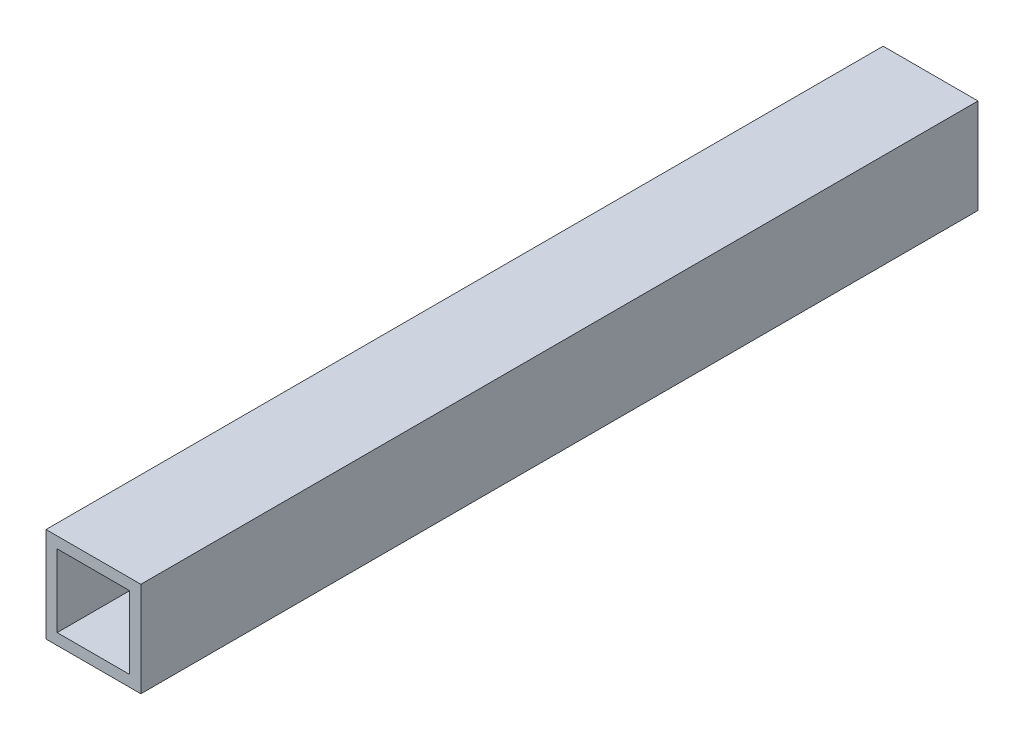
ISO-10303-21;
HEADER;
FILE_DESCRIPTION(('STEP AP214'),'2;1');
FILE_NAME('part.step','',(''),(''),'','','');
FILE_SCHEMA(('AUTOMOTIVE_DESIGN { 1 0 10303 214 1 1 1 1 }'));
ENDSEC;
DATA;
#1=APPLICATION_CONTEXT('core data for automotive mechanical design processes');
#2=APPLICATION_PROTOCOL_DEFINITION('international standard','automotive_design',2000,#1);
#3=PRODUCT_CONTEXT('',#1,'mechanical');
#4=PRODUCT('Part','Part','',(#3));
#5=PRODUCT_RELATED_PRODUCT_CATEGORY('part','',(#4));
#6=PRODUCT_DEFINITION_FORMATION('','',#4);
#7=PRODUCT_DEFINITION_CONTEXT('part definition',#1,'design');
#8=PRODUCT_DEFINITION('design','',#6,#7);
#9=PRODUCT_DEFINITION_SHAPE('','',#8);
#10=(LENGTH_UNIT() NAMED_UNIT(*) SI_UNIT(.MILLI.,.METRE.));
#11=(NAMED_UNIT(*) PLANE_ANGLE_UNIT() SI_UNIT($,.RADIAN.));
#12=(NAMED_UNIT(*) SI_UNIT($,.STERADIAN.) SOLID_ANGLE_UNIT());
#13=UNCERTAINTY_MEASURE_WITH_UNIT(LENGTH_MEASURE(1.E-05),#10,'distance_accuracy_value','');
#14=(GEOMETRIC_REPRESENTATION_CONTEXT(3) GLOBAL_UNCERTAINTY_ASSIGNED_CONTEXT((#13)) GLOBAL_UNIT_ASSIGNED_CONTEXT((#10,
#11,#12)) REPRESENTATION_CONTEXT('',''));
#15=CARTESIAN_POINT('',(0.,0.,0.));
#16=DIRECTION('',(0.,0.,1.));
#17=DIRECTION('',(1.,0.,0.));
#18=AXIS2_PLACEMENT_3D('',#15,#16,#17);
#19=CARTESIAN_POINT('',(0.,0.,150.));
#20=DIRECTION('',(0.,0.,-1.));
#21=DIRECTION('',(-1.,0.,0.));
#22=AXIS2_PLACEMENT_3D('',#19,#20,#21);
#23=PLANE('',#22);
#24=DIRECTION('',(0.,1.,0.));
#25=VECTOR('',#24,1.);
#26=CARTESIAN_POINT('',(8.5,-8.5,150.));
#27=LINE('',#26,#25);
#28=CARTESIAN_POINT('',(8.5,-8.5,150.));
#29=VERTEX_POINT('',#28);
#30=CARTESIAN_POINT('',(8.5,8.5,150.));
#31=VERTEX_POINT('',#30);
#32=EDGE_CURVE('E153',#29,#31,#27,.T.);
#33=ORIENTED_EDGE('',*,*,#32,.T.);
#34=DIRECTION('',(-1.,0.,0.));
#35=VECTOR('',#34,1.);
#36=CARTESIAN_POINT('',(-8.5,8.5,150.));
#37=LINE('',#36,#35);
#38=CARTESIAN_POINT('',(-8.5,8.5,150.));
#39=VERTEX_POINT('',#38);
#40=EDGE_CURVE('E157',#31,#39,#37,.T.);
#41=ORIENTED_EDGE('',*,*,#40,.T.);
#42=DIRECTION('',(0.,-1.,0.));
#43=VECTOR('',#42,1.);
#44=CARTESIAN_POINT('',(-8.5,-8.5,150.));
#45=LINE('',#44,#43);
#46=CARTESIAN_POINT('',(-8.5,-8.5,150.));
#47=VERTEX_POINT('',#46);
#48=EDGE_CURVE('E161',#39,#47,#45,.T.);
#49=ORIENTED_EDGE('',*,*,#48,.T.);
#50=DIRECTION('',(1.,0.,0.));
#51=VECTOR('',#50,1.);
#52=CARTESIAN_POINT('',(-8.5,-8.5,150.));
#53=LINE('',#52,#51);
#54=EDGE_CURVE('E164',#47,#29,#53,.T.);
#55=ORIENTED_EDGE('',*,*,#54,.T.);
#56=EDGE_LOOP('',(#33,#41,#49,#55));
#57=FACE_BOUND('',#56,.T.);
#58=DIRECTION('',(1.,0.,0.));
#59=VECTOR('',#58,1.);
#60=CARTESIAN_POINT('',(-6.5,-6.5,150.));
#61=LINE('',#60,#59);
#62=CARTESIAN_POINT('',(-6.5,-6.5,150.));
#63=VERTEX_POINT('',#62);
#64=CARTESIAN_POINT('',(6.5,-6.5,150.));
#65=VERTEX_POINT('',#64);
#66=EDGE_CURVE('E105',#63,#65,#61,.T.);
#67=ORIENTED_EDGE('',*,*,#66,.F.);
#68=DIRECTION('',(0.,-1.,0.));
#69=VECTOR('',#68,1.);
#70=CARTESIAN_POINT('',(-6.5,-6.5,150.));
#71=LINE('',#70,#69);
#72=CARTESIAN_POINT('',(-6.5,6.5,150.));
#73=VERTEX_POINT('',#72);
#74=EDGE_CURVE('E131',#73,#63,#71,.T.);
#75=ORIENTED_EDGE('',*,*,#74,.F.);
#76=DIRECTION('',(-1.,0.,0.));
#77=VECTOR('',#76,1.);
#78=CARTESIAN_POINT('',(-6.5,6.5,150.));
#79=LINE('',#78,#77);
#80=CARTESIAN_POINT('',(6.5,6.5,150.));
#81=VERTEX_POINT('',#80);
#82=EDGE_CURVE('E127',#81,#73,#79,.T.);
#83=ORIENTED_EDGE('',*,*,#82,.F.);
#84=DIRECTION('',(0.,1.,0.));
#85=VECTOR('',#84,1.);
#86=CARTESIAN_POINT('',(6.5,-6.5,150.));
#87=LINE('',#86,#85);
#88=EDGE_CURVE('E114',#65,#81,#87,.T.);
#89=ORIENTED_EDGE('',*,*,#88,.F.);
#90=EDGE_LOOP('',(#67,#75,#83,#89));
#91=FACE_BOUND('',#90,.T.);
#92=ADVANCED_FACE('F39',(#57,#91),#23,.F.);
#93=CARTESIAN_POINT('',(0.,0.,0.));
#94=DIRECTION('',(0.,0.,-1.));
#95=DIRECTION('',(-1.,0.,0.));
#96=AXIS2_PLACEMENT_3D('',#93,#94,#95);
#97=PLANE('',#96);
#98=DIRECTION('',(0.,1.,0.));
#99=VECTOR('',#98,1.);
#100=CARTESIAN_POINT('',(8.5,-8.5,0.));
#101=LINE('',#100,#99);
#102=CARTESIAN_POINT('',(8.5,-8.5,0.));
#103=VERTEX_POINT('',#102);
#104=CARTESIAN_POINT('',(8.5,8.5,0.));
#105=VERTEX_POINT('',#104);
#106=EDGE_CURVE('E123',#103,#105,#101,.T.);
#107=ORIENTED_EDGE('',*,*,#106,.F.);
#108=DIRECTION('',(1.,0.,0.));
#109=VECTOR('',#108,1.);
#110=CARTESIAN_POINT('',(-8.5,-8.5,0.));
#111=LINE('',#110,#109);
#112=CARTESIAN_POINT('',(-8.5,-8.5,0.));
#113=VERTEX_POINT('',#112);
#114=EDGE_CURVE('E158',#113,#103,#111,.T.);
#115=ORIENTED_EDGE('',*,*,#114,.F.);
#116=DIRECTION('',(0.,-1.,0.));
#117=VECTOR('',#116,1.);
#118=CARTESIAN_POINT('',(-8.5,-8.5,0.));
#119=LINE('',#118,#117);
#120=CARTESIAN_POINT('',(-8.5,8.5,0.));
#121=VERTEX_POINT('',#120);
#122=EDGE_CURVE('E174',#121,#113,#119,.T.);
#123=ORIENTED_EDGE('',*,*,#122,.F.);
#124=DIRECTION('',(-1.,0.,0.));
#125=VECTOR('',#124,1.);
#126=CARTESIAN_POINT('',(-8.5,8.5,0.));
#127=LINE('',#126,#125);
#128=EDGE_CURVE('E171',#105,#121,#127,.T.);
#129=ORIENTED_EDGE('',*,*,#128,.F.);
#130=EDGE_LOOP('',(#107,#115,#123,#129));
#131=FACE_BOUND('',#130,.T.);
#132=DIRECTION('',(0.,-1.,0.));
#133=VECTOR('',#132,1.);
#134=CARTESIAN_POINT('',(-6.5,-6.5,0.));
#135=LINE('',#134,#133);
#136=CARTESIAN_POINT('',(-6.5,6.5,0.));
#137=VERTEX_POINT('',#136);
#138=CARTESIAN_POINT('',(-6.5,-6.5,0.));
#139=VERTEX_POINT('',#138);
#140=EDGE_CURVE('E115',#137,#139,#135,.T.);
#141=ORIENTED_EDGE('',*,*,#140,.T.);
#142=DIRECTION('',(1.,0.,0.));
#143=VECTOR('',#142,1.);
#144=CARTESIAN_POINT('',(-6.5,-6.5,0.));
#145=LINE('',#144,#143);
#146=CARTESIAN_POINT('',(6.5,-6.5,0.));
#147=VERTEX_POINT('',#146);
#148=EDGE_CURVE('E63',#139,#147,#145,.T.);
#149=ORIENTED_EDGE('',*,*,#148,.T.);
#150=DIRECTION('',(0.,1.,0.));
#151=VECTOR('',#150,1.);
#152=CARTESIAN_POINT('',(6.5,-6.5,0.));
#153=LINE('',#152,#151);
#154=CARTESIAN_POINT('',(6.5,6.5,0.));
#155=VERTEX_POINT('',#154);
#156=EDGE_CURVE('E121',#147,#155,#153,.T.);
#157=ORIENTED_EDGE('',*,*,#156,.T.);
#158=DIRECTION('',(-1.,0.,0.));
#159=VECTOR('',#158,1.);
#160=CARTESIAN_POINT('',(-6.5,6.5,0.));
#161=LINE('',#160,#159);
#162=EDGE_CURVE('E140',#155,#137,#161,.T.);
#163=ORIENTED_EDGE('',*,*,#162,.T.);
#164=EDGE_LOOP('',(#141,#149,#157,#163));
#165=FACE_BOUND('',#164,.T.);
#166=ADVANCED_FACE('F197',(#131,#165),#97,.T.);
#167=CARTESIAN_POINT('',(8.5,-8.5,150.));
#168=DIRECTION('',(-1.,0.,0.));
#169=DIRECTION('',(0.,0.,1.));
#170=AXIS2_PLACEMENT_3D('',#167,#168,#169);
#171=PLANE('',#170);
#172=ORIENTED_EDGE('',*,*,#106,.T.);
#173=DIRECTION('',(0.,0.,-1.));
#174=VECTOR('',#173,1.);
#175=CARTESIAN_POINT('',(8.5,8.5,150.));
#176=LINE('',#175,#174);
#177=EDGE_CURVE('E11',#31,#105,#176,.T.);
#178=ORIENTED_EDGE('',*,*,#177,.F.);
#179=ORIENTED_EDGE('',*,*,#32,.F.);
#180=DIRECTION('',(0.,0.,-1.));
#181=VECTOR('',#180,1.);
#182=CARTESIAN_POINT('',(8.5,-8.5,150.));
#183=LINE('',#182,#181);
#184=EDGE_CURVE('E167',#29,#103,#183,.T.);
#185=ORIENTED_EDGE('',*,*,#184,.T.);
#186=EDGE_LOOP('',(#172,#178,#179,#185));
#187=FACE_BOUND('',#186,.T.);
#188=ADVANCED_FACE('F41',(#187),#171,.F.);
#189=CARTESIAN_POINT('',(-8.5,8.5,150.));
#190=DIRECTION('',(0.,-1.,0.));
#191=DIRECTION('',(0.,0.,-1.));
#192=AXIS2_PLACEMENT_3D('',#189,#190,#191);
#193=PLANE('',#192);
#194=ORIENTED_EDGE('',*,*,#128,.T.);
#195=DIRECTION('',(0.,0.,-1.));
#196=VECTOR('',#195,1.);
#197=CARTESIAN_POINT('',(-8.5,8.5,150.));
#198=LINE('',#197,#196);
#199=EDGE_CURVE('E48',#39,#121,#198,.T.);
#200=ORIENTED_EDGE('',*,*,#199,.F.);
#201=ORIENTED_EDGE('',*,*,#40,.F.);
#202=ORIENTED_EDGE('',*,*,#177,.T.);
#203=EDGE_LOOP('',(#194,#200,#201,#202));
#204=FACE_BOUND('',#203,.T.);
#205=ADVANCED_FACE('F207',(#204),#193,.F.);
#206=CARTESIAN_POINT('',(-8.5,-8.5,150.));
#207=DIRECTION('',(1.,0.,0.));
#208=DIRECTION('',(0.,0.,-1.));
#209=AXIS2_PLACEMENT_3D('',#206,#207,#208);
#210=PLANE('',#209);
#211=ORIENTED_EDGE('',*,*,#122,.T.);
#212=DIRECTION('',(0.,0.,-1.));
#213=VECTOR('',#212,1.);
#214=CARTESIAN_POINT('',(-8.5,-8.5,150.));
#215=LINE('',#214,#213);
#216=EDGE_CURVE('E182',#47,#113,#215,.T.);
#217=ORIENTED_EDGE('',*,*,#216,.F.);
#218=ORIENTED_EDGE('',*,*,#48,.F.);
#219=ORIENTED_EDGE('',*,*,#199,.T.);
#220=EDGE_LOOP('',(#211,#217,#218,#219));
#221=FACE_BOUND('',#220,.T.);
#222=ADVANCED_FACE('F191',(#221),#210,.F.);
#223=CARTESIAN_POINT('',(-8.5,-8.5,150.));
#224=DIRECTION('',(0.,1.,0.));
#225=DIRECTION('',(0.,0.,1.));
#226=AXIS2_PLACEMENT_3D('',#223,#224,#225);
#227=PLANE('',#226);
#228=ORIENTED_EDGE('',*,*,#114,.T.);
#229=ORIENTED_EDGE('',*,*,#184,.F.);
#230=ORIENTED_EDGE('',*,*,#54,.F.);
#231=ORIENTED_EDGE('',*,*,#216,.T.);
#232=EDGE_LOOP('',(#228,#229,#230,#231));
#233=FACE_BOUND('',#232,.T.);
#234=ADVANCED_FACE('F201',(#233),#227,.F.);
#235=CARTESIAN_POINT('',(-6.5,-6.5,150.));
#236=DIRECTION('',(0.,1.,0.));
#237=DIRECTION('',(0.,0.,1.));
#238=AXIS2_PLACEMENT_3D('',#235,#236,#237);
#239=PLANE('',#238);
#240=ORIENTED_EDGE('',*,*,#148,.F.);
#241=DIRECTION('',(0.,0.,-1.));
#242=VECTOR('',#241,1.);
#243=CARTESIAN_POINT('',(-6.5,-6.5,150.));
#244=LINE('',#243,#242);
#245=EDGE_CURVE('E109',#63,#139,#244,.T.);
#246=ORIENTED_EDGE('',*,*,#245,.F.);
#247=ORIENTED_EDGE('',*,*,#66,.T.);
#248=DIRECTION('',(0.,0.,-1.));
#249=VECTOR('',#248,1.);
#250=CARTESIAN_POINT('',(6.5,-6.5,150.));
#251=LINE('',#250,#249);
#252=EDGE_CURVE('E108',#65,#147,#251,.T.);
#253=ORIENTED_EDGE('',*,*,#252,.T.);
#254=EDGE_LOOP('',(#240,#246,#247,#253));
#255=FACE_BOUND('',#254,.T.);
#256=ADVANCED_FACE('F107',(#255),#239,.T.);
#257=CARTESIAN_POINT('',(6.5,-6.5,150.));
#258=DIRECTION('',(-1.,0.,0.));
#259=DIRECTION('',(0.,0.,1.));
#260=AXIS2_PLACEMENT_3D('',#257,#258,#259);
#261=PLANE('',#260);
#262=ORIENTED_EDGE('',*,*,#156,.F.);
#263=ORIENTED_EDGE('',*,*,#252,.F.);
#264=ORIENTED_EDGE('',*,*,#88,.T.);
#265=DIRECTION('',(0.,0.,-1.));
#266=VECTOR('',#265,1.);
#267=CARTESIAN_POINT('',(6.5,6.5,150.));
#268=LINE('',#267,#266);
#269=EDGE_CURVE('E124',#81,#155,#268,.T.);
#270=ORIENTED_EDGE('',*,*,#269,.T.);
#271=EDGE_LOOP('',(#262,#263,#264,#270));
#272=FACE_BOUND('',#271,.T.);
#273=ADVANCED_FACE('F118',(#272),#261,.T.);
#274=CARTESIAN_POINT('',(-6.5,6.5,150.));
#275=DIRECTION('',(0.,-1.,0.));
#276=DIRECTION('',(0.,0.,-1.));
#277=AXIS2_PLACEMENT_3D('',#274,#275,#276);
#278=PLANE('',#277);
#279=ORIENTED_EDGE('',*,*,#162,.F.);
#280=ORIENTED_EDGE('',*,*,#269,.F.);
#281=ORIENTED_EDGE('',*,*,#82,.T.);
#282=DIRECTION('',(0.,0.,-1.));
#283=VECTOR('',#282,1.);
#284=CARTESIAN_POINT('',(-6.5,6.5,150.));
#285=LINE('',#284,#283);
#286=EDGE_CURVE('E55',#73,#137,#285,.T.);
#287=ORIENTED_EDGE('',*,*,#286,.T.);
#288=EDGE_LOOP('',(#279,#280,#281,#287));
#289=FACE_BOUND('',#288,.T.);
#290=ADVANCED_FACE('F230',(#289),#278,.T.);
#291=CARTESIAN_POINT('',(-6.5,-6.5,150.));
#292=DIRECTION('',(1.,0.,0.));
#293=DIRECTION('',(0.,0.,-1.));
#294=AXIS2_PLACEMENT_3D('',#291,#292,#293);
#295=PLANE('',#294);
#296=ORIENTED_EDGE('',*,*,#140,.F.);
#297=ORIENTED_EDGE('',*,*,#286,.F.);
#298=ORIENTED_EDGE('',*,*,#74,.T.);
#299=ORIENTED_EDGE('',*,*,#245,.T.);
#300=EDGE_LOOP('',(#296,#297,#298,#299));
#301=FACE_BOUND('',#300,.T.);
#302=ADVANCED_FACE('F234',(#301),#295,.T.);
#303=CLOSED_SHELL('',(#92,#166,#188,#205,#222,#234,#256,#273,#290,#302));
#304=MANIFOLD_SOLID_BREP('B2',#303);
#305=ADVANCED_BREP_SHAPE_REPRESENTATION('',(#18,#304),#14);
#306=SHAPE_DEFINITION_REPRESENTATION(#9,#305);
ENDSEC;
END-ISO-10303-21;
